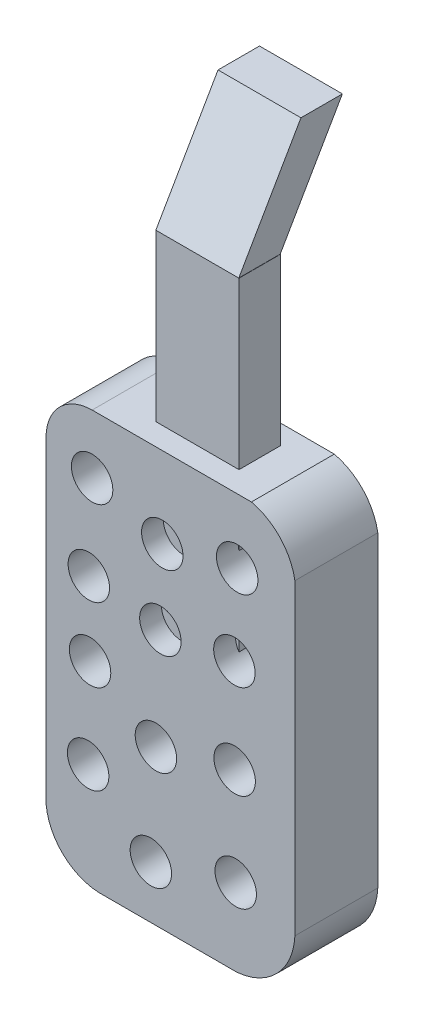
ISO-10303-21;
HEADER;
FILE_DESCRIPTION(('STEP AP214'),'2;1');
FILE_NAME('part.step','',(''),(''),'','','');
FILE_SCHEMA(('AUTOMOTIVE_DESIGN { 1 0 10303 214 1 1 1 1 }'));
ENDSEC;
DATA;
#1=APPLICATION_CONTEXT('core data for automotive mechanical design processes');
#2=APPLICATION_PROTOCOL_DEFINITION('international standard','automotive_design',2000,#1);
#3=PRODUCT_CONTEXT('',#1,'mechanical');
#4=PRODUCT('Part','Part','',(#3));
#5=PRODUCT_RELATED_PRODUCT_CATEGORY('part','',(#4));
#6=PRODUCT_DEFINITION_FORMATION('','',#4);
#7=PRODUCT_DEFINITION_CONTEXT('part definition',#1,'design');
#8=PRODUCT_DEFINITION('design','',#6,#7);
#9=PRODUCT_DEFINITION_SHAPE('','',#8);
#10=(LENGTH_UNIT() NAMED_UNIT(*) SI_UNIT(.MILLI.,.METRE.));
#11=(NAMED_UNIT(*) PLANE_ANGLE_UNIT() SI_UNIT($,.RADIAN.));
#12=(NAMED_UNIT(*) SI_UNIT($,.STERADIAN.) SOLID_ANGLE_UNIT());
#13=UNCERTAINTY_MEASURE_WITH_UNIT(LENGTH_MEASURE(1.E-05),#10,'distance_accuracy_value','');
#14=(GEOMETRIC_REPRESENTATION_CONTEXT(3) GLOBAL_UNCERTAINTY_ASSIGNED_CONTEXT((#13)) GLOBAL_UNIT_ASSIGNED_CONTEXT((#10,
#11,#12)) REPRESENTATION_CONTEXT('',''));
#15=CARTESIAN_POINT('',(0.,0.,0.));
#16=DIRECTION('',(0.,0.,1.));
#17=DIRECTION('',(1.,0.,0.));
#18=AXIS2_PLACEMENT_3D('',#15,#16,#17);
#19=CARTESIAN_POINT('',(-1.89108910891088,5.,2.));
#20=DIRECTION('',(0.,-1.,0.));
#21=DIRECTION('',(0.,0.,-1.));
#22=AXIS2_PLACEMENT_3D('',#19,#20,#21);
#23=PLANE('',#22);
#24=DIRECTION('',(1.,0.,0.));
#25=VECTOR('',#24,1.);
#26=CARTESIAN_POINT('',(-1.89108910891088,5.,1.47458865052035));
#27=LINE('',#26,#25);
#28=CARTESIAN_POINT('',(-0.880000000000001,5.,1.47458865052035));
#29=VERTEX_POINT('',#28);
#30=CARTESIAN_POINT('',(1.12575668165662,5.,1.47458865052035));
#31=VERTEX_POINT('',#30);
#32=EDGE_CURVE('E61',#29,#31,#27,.T.);
#33=ORIENTED_EDGE('',*,*,#32,.F.);
#34=DIRECTION('',(0.,0.,-1.));
#35=VECTOR('',#34,1.);
#36=CARTESIAN_POINT('',(-0.880000000000001,5.,1.47458865052035));
#37=LINE('',#36,#35);
#38=CARTESIAN_POINT('',(-0.880000000000001,5.,0.474588650520346));
#39=VERTEX_POINT('',#38);
#40=EDGE_CURVE('E172',#29,#39,#37,.T.);
#41=ORIENTED_EDGE('',*,*,#40,.T.);
#42=DIRECTION('',(-1.,0.,0.));
#43=VECTOR('',#42,1.);
#44=CARTESIAN_POINT('',(-1.89108910891088,5.,0.474588650520346));
#45=LINE('',#44,#43);
#46=CARTESIAN_POINT('',(1.12575668165662,5.,0.474588650520346));
#47=VERTEX_POINT('',#46);
#48=EDGE_CURVE('E46',#47,#39,#45,.T.);
#49=ORIENTED_EDGE('',*,*,#48,.F.);
#50=DIRECTION('',(0.,0.,-1.));
#51=VECTOR('',#50,1.);
#52=CARTESIAN_POINT('',(1.12575668165662,5.,2.));
#53=LINE('',#52,#51);
#54=EDGE_CURVE('E174',#31,#47,#53,.T.);
#55=ORIENTED_EDGE('',*,*,#54,.F.);
#56=EDGE_LOOP('',(#33,#41,#49,#55));
#57=FACE_BOUND('',#56,.T.);
#58=DIRECTION('',(-1.,0.,0.));
#59=VECTOR('',#58,1.);
#60=CARTESIAN_POINT('',(-1.89108910891088,5.,0.));
#61=LINE('',#60,#59);
#62=CARTESIAN_POINT('',(1.95049504950491,5.,0.));
#63=VERTEX_POINT('',#62);
#64=CARTESIAN_POINT('',(-1.89108910891088,5.,0.));
#65=VERTEX_POINT('',#64);
#66=EDGE_CURVE('E344',#63,#65,#61,.T.);
#67=ORIENTED_EDGE('',*,*,#66,.T.);
#68=DIRECTION('',(0.,0.,-1.));
#69=VECTOR('',#68,1.);
#70=CARTESIAN_POINT('',(-1.89108910891088,5.,2.));
#71=LINE('',#70,#69);
#72=CARTESIAN_POINT('',(-1.89108910891088,5.,2.));
#73=VERTEX_POINT('',#72);
#74=EDGE_CURVE('E354',#73,#65,#71,.T.);
#75=ORIENTED_EDGE('',*,*,#74,.F.);
#76=DIRECTION('',(-1.,0.,0.));
#77=VECTOR('',#76,1.);
#78=CARTESIAN_POINT('',(-1.89108910891088,5.,2.));
#79=LINE('',#78,#77);
#80=CARTESIAN_POINT('',(1.95049504950491,5.,2.));
#81=VERTEX_POINT('',#80);
#82=EDGE_CURVE('E327',#81,#73,#79,.T.);
#83=ORIENTED_EDGE('',*,*,#82,.F.);
#84=DIRECTION('',(0.,0.,-1.));
#85=VECTOR('',#84,1.);
#86=CARTESIAN_POINT('',(1.95049504950491,5.,2.));
#87=LINE('',#86,#85);
#88=EDGE_CURVE('E357',#81,#63,#87,.T.);
#89=ORIENTED_EDGE('',*,*,#88,.T.);
#90=EDGE_LOOP('',(#67,#75,#83,#89));
#91=FACE_BOUND('',#90,.T.);
#92=ADVANCED_FACE('F38',(#57,#91),#23,.F.);
#93=CARTESIAN_POINT('',(-0.199450068187109,3.04670724631257,1.00000000000955));
#94=DIRECTION('',(0.,0.,1.));
#95=DIRECTION('',(1.,0.,0.));
#96=AXIS2_PLACEMENT_3D('',#93,#94,#95);
#97=CYLINDRICAL_SURFACE('',#96,0.5);
#98=CARTESIAN_POINT('',(-0.199450068187109,3.04670724631257,2.00000000000955));
#99=DIRECTION('',(0.,0.,1.));
#100=DIRECTION('',(1.,0.,0.));
#101=AXIS2_PLACEMENT_3D('',#98,#99,#100);
#102=CIRCLE('',#101,0.5);
#103=CARTESIAN_POINT('',(0.300549931812891,3.04670724631257,2.00000000000955));
#104=VERTEX_POINT('',#103);
#105=EDGE_CURVE('E303',#104,#104,#102,.T.);
#106=ORIENTED_EDGE('',*,*,#105,.T.);
#107=EDGE_LOOP('',(#106));
#108=FACE_BOUND('',#107,.T.);
#109=CARTESIAN_POINT('',(-0.199450068187109,3.04670724631257,1.47458865052035));
#110=DIRECTION('',(0.,0.,-1.));
#111=DIRECTION('',(-1.,0.,0.));
#112=AXIS2_PLACEMENT_3D('',#109,#110,#111);
#113=CIRCLE('',#112,0.5);
#114=CARTESIAN_POINT('',(-0.699450068187109,3.04670724631257,1.47458865052035));
#115=VERTEX_POINT('',#114);
#116=EDGE_CURVE('E244',#115,#115,#113,.F.);
#117=ORIENTED_EDGE('',*,*,#116,.F.);
#118=EDGE_LOOP('',(#117));
#119=FACE_BOUND('',#118,.T.);
#120=ADVANCED_FACE('F404',(#108,#119),#97,.F.);
#121=CARTESIAN_POINT('',(1.60719420206298,3.44237727244169,1.));
#122=DIRECTION('',(0.,0.,1.));
#123=DIRECTION('',(1.,0.,0.));
#124=AXIS2_PLACEMENT_3D('',#121,#122,#123);
#125=CYLINDRICAL_SURFACE('',#124,0.5);
#126=CARTESIAN_POINT('',(1.60719420206298,3.44237727244169,2.));
#127=DIRECTION('',(0.,0.,1.));
#128=DIRECTION('',(1.,0.,0.));
#129=AXIS2_PLACEMENT_3D('',#126,#127,#128);
#130=CIRCLE('',#129,0.5);
#131=CARTESIAN_POINT('',(2.10719420206298,3.44237727244169,2.));
#132=VERTEX_POINT('',#131);
#133=EDGE_CURVE('E297',#132,#132,#130,.T.);
#134=ORIENTED_EDGE('',*,*,#133,.T.);
#135=EDGE_LOOP('',(#134));
#136=FACE_BOUND('',#135,.T.);
#137=DIRECTION('',(0.,0.,1.));
#138=VECTOR('',#137,1.);
#139=CARTESIAN_POINT('',(1.12575668165662,3.30740351964147,1.));
#140=LINE('',#139,#138);
#141=CARTESIAN_POINT('',(1.12575668165662,3.30740351964147,1.47458865052035));
#142=VERTEX_POINT('',#141);
#143=CARTESIAN_POINT('',(1.12575668165662,3.30740351964147,1.));
#144=VERTEX_POINT('',#143);
#145=EDGE_CURVE('E238',#142,#144,#140,.F.);
#146=ORIENTED_EDGE('',*,*,#145,.F.);
#147=CARTESIAN_POINT('',(1.60719420206298,3.44237727244169,1.47458865052035));
#148=DIRECTION('',(0.,0.,-1.));
#149=DIRECTION('',(-1.,0.,0.));
#150=AXIS2_PLACEMENT_3D('',#147,#148,#149);
#151=CIRCLE('',#150,0.5);
#152=CARTESIAN_POINT('',(1.12575668165662,3.57735102524191,1.47458865052035));
#153=VERTEX_POINT('',#152);
#154=EDGE_CURVE('E177',#153,#142,#151,.F.);
#155=ORIENTED_EDGE('',*,*,#154,.F.);
#156=DIRECTION('',(0.,0.,1.));
#157=VECTOR('',#156,1.);
#158=CARTESIAN_POINT('',(1.12575668165662,3.57735102524191,1.));
#159=LINE('',#158,#157);
#160=CARTESIAN_POINT('',(1.12575668165662,3.57735102524191,1.));
#161=VERTEX_POINT('',#160);
#162=EDGE_CURVE('E236',#161,#153,#159,.T.);
#163=ORIENTED_EDGE('',*,*,#162,.F.);
#164=CARTESIAN_POINT('',(1.60719420206298,3.44237727244169,1.));
#165=DIRECTION('',(0.,0.,1.));
#166=DIRECTION('',(1.,0.,0.));
#167=AXIS2_PLACEMENT_3D('',#164,#165,#166);
#168=CIRCLE('',#167,0.5);
#169=EDGE_CURVE('E300',#144,#161,#168,.T.);
#170=ORIENTED_EDGE('',*,*,#169,.F.);
#171=EDGE_LOOP('',(#146,#155,#163,#170));
#172=FACE_BOUND('',#171,.T.);
#173=ADVANCED_FACE('F409',(#136,#172),#125,.F.);
#174=CARTESIAN_POINT('',(1.60719420206298,3.44237727244169,1.));
#175=DIRECTION('',(0.,0.,1.));
#176=DIRECTION('',(1.,0.,0.));
#177=AXIS2_PLACEMENT_3D('',#174,#175,#176);
#178=PLANE('',#177);
#179=ORIENTED_EDGE('',*,*,#169,.T.);
#180=DIRECTION('',(0.,-1.,0.));
#181=VECTOR('',#180,1.);
#182=CARTESIAN_POINT('',(1.12575668165662,3.44237727244169,1.));
#183=LINE('',#182,#181);
#184=EDGE_CURVE('E233',#161,#144,#183,.T.);
#185=ORIENTED_EDGE('',*,*,#184,.T.);
#186=EDGE_LOOP('',(#179,#185));
#187=FACE_BOUND('',#186,.T.);
#188=ADVANCED_FACE('F487',(#187),#178,.T.);
#189=CARTESIAN_POINT('',(-0.245391974143416,1.23022672205764,1.00000000000955));
#190=DIRECTION('',(0.,0.,1.));
#191=DIRECTION('',(1.,0.,0.));
#192=AXIS2_PLACEMENT_3D('',#189,#190,#191);
#193=CYLINDRICAL_SURFACE('',#192,0.5);
#194=CARTESIAN_POINT('',(-0.245391974143416,1.23022672205764,2.00000000000955));
#195=DIRECTION('',(0.,0.,1.));
#196=DIRECTION('',(1.,0.,0.));
#197=AXIS2_PLACEMENT_3D('',#194,#195,#196);
#198=CIRCLE('',#197,0.5);
#199=CARTESIAN_POINT('',(0.254608025856584,1.23022672205764,2.00000000000955));
#200=VERTEX_POINT('',#199);
#201=EDGE_CURVE('E288',#200,#200,#198,.T.);
#202=ORIENTED_EDGE('',*,*,#201,.T.);
#203=EDGE_LOOP('',(#202));
#204=FACE_BOUND('',#203,.T.);
#205=CARTESIAN_POINT('',(-0.245391974143416,1.23022672205764,1.47458865052035));
#206=DIRECTION('',(0.,0.,-1.));
#207=DIRECTION('',(-1.,0.,0.));
#208=AXIS2_PLACEMENT_3D('',#205,#206,#207);
#209=CIRCLE('',#208,0.5);
#210=CARTESIAN_POINT('',(-0.745391974143416,1.23022672205764,1.47458865052035));
#211=VERTEX_POINT('',#210);
#212=EDGE_CURVE('E241',#211,#211,#209,.F.);
#213=ORIENTED_EDGE('',*,*,#212,.F.);
#214=EDGE_LOOP('',(#213));
#215=FACE_BOUND('',#214,.T.);
#216=ADVANCED_FACE('F491',(#204,#215),#193,.F.);
#217=CARTESIAN_POINT('',(1.54051220604856,1.46976243669883,1.00000000000955));
#218=DIRECTION('',(0.,0.,1.));
#219=DIRECTION('',(1.,0.,0.));
#220=AXIS2_PLACEMENT_3D('',#217,#218,#219);
#221=CYLINDRICAL_SURFACE('',#220,0.5);
#222=CARTESIAN_POINT('',(1.54051220604856,1.46976243669883,2.00000000000955));
#223=DIRECTION('',(0.,0.,1.));
#224=DIRECTION('',(1.,0.,0.));
#225=AXIS2_PLACEMENT_3D('',#222,#223,#224);
#226=CIRCLE('',#225,0.5);
#227=CARTESIAN_POINT('',(2.04051220604856,1.46976243669883,2.00000000000955));
#228=VERTEX_POINT('',#227);
#229=EDGE_CURVE('E282',#228,#228,#226,.T.);
#230=ORIENTED_EDGE('',*,*,#229,.T.);
#231=EDGE_LOOP('',(#230));
#232=FACE_BOUND('',#231,.T.);
#233=DIRECTION('',(0.,0.,1.));
#234=VECTOR('',#233,1.);
#235=CARTESIAN_POINT('',(1.12575668165662,1.19051728457194,1.00000000000955));
#236=LINE('',#235,#234);
#237=CARTESIAN_POINT('',(1.12575668165662,1.19051728457194,1.47458865052035));
#238=VERTEX_POINT('',#237);
#239=CARTESIAN_POINT('',(1.12575668165662,1.19051728457194,1.00000000000955));
#240=VERTEX_POINT('',#239);
#241=EDGE_CURVE('E231',#238,#240,#236,.F.);
#242=ORIENTED_EDGE('',*,*,#241,.F.);
#243=CARTESIAN_POINT('',(1.54051220604856,1.46976243669883,1.47458865052035));
#244=DIRECTION('',(0.,0.,-1.));
#245=DIRECTION('',(-1.,0.,0.));
#246=AXIS2_PLACEMENT_3D('',#243,#244,#245);
#247=CIRCLE('',#246,0.5);
#248=CARTESIAN_POINT('',(1.12575668165662,1.74900758882572,1.47458865052035));
#249=VERTEX_POINT('',#248);
#250=EDGE_CURVE('E245',#249,#238,#247,.F.);
#251=ORIENTED_EDGE('',*,*,#250,.F.);
#252=DIRECTION('',(0.,0.,1.));
#253=VECTOR('',#252,1.);
#254=CARTESIAN_POINT('',(1.12575668165662,1.74900758882572,1.00000000000955));
#255=LINE('',#254,#253);
#256=CARTESIAN_POINT('',(1.12575668165662,1.74900758882572,1.00000000000955));
#257=VERTEX_POINT('',#256);
#258=EDGE_CURVE('E228',#257,#249,#255,.T.);
#259=ORIENTED_EDGE('',*,*,#258,.F.);
#260=CARTESIAN_POINT('',(1.54051220604856,1.46976243669883,1.00000000000955));
#261=DIRECTION('',(0.,0.,1.));
#262=DIRECTION('',(1.,0.,0.));
#263=AXIS2_PLACEMENT_3D('',#260,#261,#262);
#264=CIRCLE('',#263,0.5);
#265=EDGE_CURVE('E285',#240,#257,#264,.T.);
#266=ORIENTED_EDGE('',*,*,#265,.F.);
#267=EDGE_LOOP('',(#242,#251,#259,#266));
#268=FACE_BOUND('',#267,.T.);
#269=ADVANCED_FACE('F503',(#232,#268),#221,.F.);
#270=CARTESIAN_POINT('',(1.54051220604856,1.46976243669883,1.00000000000955));
#271=DIRECTION('',(0.,0.,1.));
#272=DIRECTION('',(1.,0.,0.));
#273=AXIS2_PLACEMENT_3D('',#270,#271,#272);
#274=PLANE('',#273);
#275=ORIENTED_EDGE('',*,*,#265,.T.);
#276=DIRECTION('',(0.,-1.,0.));
#277=VECTOR('',#276,1.);
#278=CARTESIAN_POINT('',(1.12575668165662,1.46976243669883,1.00000000000955));
#279=LINE('',#278,#277);
#280=EDGE_CURVE('E372',#257,#240,#279,.T.);
#281=ORIENTED_EDGE('',*,*,#280,.T.);
#282=EDGE_LOOP('',(#275,#281));
#283=FACE_BOUND('',#282,.T.);
#284=ADVANCED_FACE('F433',(#283),#274,.T.);
#285=CARTESIAN_POINT('',(-1.67129992270383,-3.66574465270561,2.));
#286=DIRECTION('',(0.,0.,-1.));
#287=DIRECTION('',(-1.,0.,0.));
#288=AXIS2_PLACEMENT_3D('',#285,#286,#287);
#289=CYLINDRICAL_SURFACE('',#288,1.33566613313877);
#290=CARTESIAN_POINT('',(-1.67129992270383,-3.66574465270561,0.));
#291=DIRECTION('',(0.,0.,1.));
#292=DIRECTION('',(1.,0.,0.));
#293=AXIS2_PLACEMENT_3D('',#290,#291,#292);
#294=CIRCLE('',#293,1.33566613313877);
#295=CARTESIAN_POINT('',(-3.,-3.80198019801974,0.));
#296=VERTEX_POINT('',#295);
#297=CARTESIAN_POINT('',(-1.73267326732673,-5.,0.));
#298=VERTEX_POINT('',#297);
#299=EDGE_CURVE('E312',#296,#298,#294,.T.);
#300=ORIENTED_EDGE('',*,*,#299,.T.);
#301=DIRECTION('',(0.,0.,-1.));
#302=VECTOR('',#301,1.);
#303=CARTESIAN_POINT('',(-1.73267326732673,-5.,2.));
#304=LINE('',#303,#302);
#305=CARTESIAN_POINT('',(-1.73267326732673,-5.,2.));
#306=VERTEX_POINT('',#305);
#307=EDGE_CURVE('E369',#306,#298,#304,.T.);
#308=ORIENTED_EDGE('',*,*,#307,.F.);
#309=CARTESIAN_POINT('',(-1.67129992270383,-3.66574465270561,2.));
#310=DIRECTION('',(0.,0.,1.));
#311=DIRECTION('',(1.,0.,0.));
#312=AXIS2_PLACEMENT_3D('',#309,#310,#311);
#313=CIRCLE('',#312,1.33566613313877);
#314=CARTESIAN_POINT('',(-3.,-3.80198019801974,2.));
#315=VERTEX_POINT('',#314);
#316=EDGE_CURVE('E315',#315,#306,#313,.T.);
#317=ORIENTED_EDGE('',*,*,#316,.F.);
#318=DIRECTION('',(0.,0.,-1.));
#319=VECTOR('',#318,1.);
#320=CARTESIAN_POINT('',(-3.,-3.80198019801974,2.));
#321=LINE('',#320,#319);
#322=EDGE_CURVE('E333',#315,#296,#321,.T.);
#323=ORIENTED_EDGE('',*,*,#322,.T.);
#324=EDGE_LOOP('',(#300,#308,#317,#323));
#325=FACE_BOUND('',#324,.T.);
#326=ADVANCED_FACE('F40',(#325),#289,.T.);
#327=CARTESIAN_POINT('',(-1.73267326732673,-5.,2.));
#328=DIRECTION('',(0.,1.,0.));
#329=DIRECTION('',(0.,0.,1.));
#330=AXIS2_PLACEMENT_3D('',#327,#328,#329);
#331=PLANE('',#330);
#332=DIRECTION('',(1.,0.,0.));
#333=VECTOR('',#332,1.);
#334=CARTESIAN_POINT('',(-1.73267326732673,-5.,0.));
#335=LINE('',#334,#333);
#336=CARTESIAN_POINT('',(1.6089108910891,-5.,0.));
#337=VERTEX_POINT('',#336);
#338=EDGE_CURVE('E336',#298,#337,#335,.T.);
#339=ORIENTED_EDGE('',*,*,#338,.T.);
#340=DIRECTION('',(0.,0.,-1.));
#341=VECTOR('',#340,1.);
#342=CARTESIAN_POINT('',(1.6089108910891,-5.,2.));
#343=LINE('',#342,#341);
#344=CARTESIAN_POINT('',(1.6089108910891,-5.,2.));
#345=VERTEX_POINT('',#344);
#346=EDGE_CURVE('E366',#345,#337,#343,.T.);
#347=ORIENTED_EDGE('',*,*,#346,.F.);
#348=DIRECTION('',(1.,0.,0.));
#349=VECTOR('',#348,1.);
#350=CARTESIAN_POINT('',(-1.73267326732673,-5.,2.));
#351=LINE('',#350,#349);
#352=EDGE_CURVE('E318',#306,#345,#351,.T.);
#353=ORIENTED_EDGE('',*,*,#352,.F.);
#354=ORIENTED_EDGE('',*,*,#307,.T.);
#355=EDGE_LOOP('',(#339,#347,#353,#354));
#356=FACE_BOUND('',#355,.T.);
#357=ADVANCED_FACE('F426',(#356),#331,.F.);
#358=CARTESIAN_POINT('',(1.4651151002762,-3.47029473606105,2.));
#359=DIRECTION('',(0.,0.,-1.));
#360=DIRECTION('',(-1.,0.,0.));
#361=AXIS2_PLACEMENT_3D('',#358,#359,#360);
#362=CYLINDRICAL_SURFACE('',#361,1.53644896562758);
#363=CARTESIAN_POINT('',(1.4651151002762,-3.47029473606105,0.));
#364=DIRECTION('',(0.,0.,1.));
#365=DIRECTION('',(-1.,0.,0.));
#366=AXIS2_PLACEMENT_3D('',#363,#364,#365);
#367=CIRCLE('',#366,1.53644896562758);
#368=CARTESIAN_POINT('',(3.,-3.53960396039604,0.));
#369=VERTEX_POINT('',#368);
#370=EDGE_CURVE('E338',#337,#369,#367,.T.);
#371=ORIENTED_EDGE('',*,*,#370,.T.);
#372=DIRECTION('',(0.,0.,-1.));
#373=VECTOR('',#372,1.);
#374=CARTESIAN_POINT('',(3.,-3.53960396039604,2.));
#375=LINE('',#374,#373);
#376=CARTESIAN_POINT('',(3.,-3.53960396039604,2.));
#377=VERTEX_POINT('',#376);
#378=EDGE_CURVE('E363',#377,#369,#375,.T.);
#379=ORIENTED_EDGE('',*,*,#378,.F.);
#380=CARTESIAN_POINT('',(1.4651151002762,-3.47029473606105,2.));
#381=DIRECTION('',(0.,0.,1.));
#382=DIRECTION('',(-1.,0.,0.));
#383=AXIS2_PLACEMENT_3D('',#380,#381,#382);
#384=CIRCLE('',#383,1.53644896562758);
#385=EDGE_CURVE('E321',#345,#377,#384,.T.);
#386=ORIENTED_EDGE('',*,*,#385,.F.);
#387=ORIENTED_EDGE('',*,*,#346,.T.);
#388=EDGE_LOOP('',(#371,#379,#386,#387));
#389=FACE_BOUND('',#388,.T.);
#390=ADVANCED_FACE('F423',(#389),#362,.T.);
#391=CARTESIAN_POINT('',(3.,3.88118811881188,2.));
#392=DIRECTION('',(-1.,0.,0.));
#393=DIRECTION('',(0.,-1.,0.));
#394=AXIS2_PLACEMENT_3D('',#391,#392,#393);
#395=PLANE('',#394);
#396=DIRECTION('',(0.,1.,0.));
#397=VECTOR('',#396,1.);
#398=CARTESIAN_POINT('',(3.,3.88118811881188,0.));
#399=LINE('',#398,#397);
#400=CARTESIAN_POINT('',(3.,3.88118811881188,0.));
#401=VERTEX_POINT('',#400);
#402=EDGE_CURVE('E340',#369,#401,#399,.T.);
#403=ORIENTED_EDGE('',*,*,#402,.T.);
#404=DIRECTION('',(0.,0.,-1.));
#405=VECTOR('',#404,1.);
#406=CARTESIAN_POINT('',(3.,3.88118811881188,2.));
#407=LINE('',#406,#405);
#408=CARTESIAN_POINT('',(3.,3.88118811881188,2.));
#409=VERTEX_POINT('',#408);
#410=EDGE_CURVE('E360',#409,#401,#407,.T.);
#411=ORIENTED_EDGE('',*,*,#410,.F.);
#412=DIRECTION('',(0.,1.,0.));
#413=VECTOR('',#412,1.);
#414=CARTESIAN_POINT('',(3.,3.88118811881188,2.));
#415=LINE('',#414,#413);
#416=EDGE_CURVE('E323',#377,#409,#415,.T.);
#417=ORIENTED_EDGE('',*,*,#416,.F.);
#418=ORIENTED_EDGE('',*,*,#378,.T.);
#419=EDGE_LOOP('',(#403,#411,#417,#418));
#420=FACE_BOUND('',#419,.T.);
#421=ADVANCED_FACE('F419',(#420),#395,.F.);
#422=CARTESIAN_POINT('',(1.6335461950254,3.65103352001593,2.));
#423=DIRECTION('',(0.,0.,-1.));
#424=DIRECTION('',(-1.,0.,0.));
#425=AXIS2_PLACEMENT_3D('',#422,#423,#424);
#426=CYLINDRICAL_SURFACE('',#425,1.38570095636703);
#427=CARTESIAN_POINT('',(1.6335461950254,3.65103352001593,0.));
#428=DIRECTION('',(0.,0.,1.));
#429=DIRECTION('',(-1.,0.,0.));
#430=AXIS2_PLACEMENT_3D('',#427,#428,#429);
#431=CIRCLE('',#430,1.38570095636703);
#432=EDGE_CURVE('E342',#401,#63,#431,.T.);
#433=ORIENTED_EDGE('',*,*,#432,.T.);
#434=ORIENTED_EDGE('',*,*,#88,.F.);
#435=CARTESIAN_POINT('',(1.6335461950254,3.65103352001593,2.));
#436=DIRECTION('',(0.,0.,1.));
#437=DIRECTION('',(-1.,0.,0.));
#438=AXIS2_PLACEMENT_3D('',#435,#436,#437);
#439=CIRCLE('',#438,1.38570095636703);
#440=EDGE_CURVE('E325',#409,#81,#439,.T.);
#441=ORIENTED_EDGE('',*,*,#440,.F.);
#442=ORIENTED_EDGE('',*,*,#410,.T.);
#443=EDGE_LOOP('',(#433,#434,#441,#442));
#444=FACE_BOUND('',#443,.T.);
#445=ADVANCED_FACE('F416',(#444),#426,.T.);
#446=CARTESIAN_POINT('',(-1.88138681820285,3.87842976779921,2.));
#447=DIRECTION('',(0.,0.,-1.));
#448=DIRECTION('',(-1.,0.,0.));
#449=AXIS2_PLACEMENT_3D('',#446,#447,#448);
#450=CYLINDRICAL_SURFACE('',#449,1.12161219688621);
#451=CARTESIAN_POINT('',(-1.88138681820285,3.87842976779921,0.));
#452=DIRECTION('',(0.,0.,1.));
#453=DIRECTION('',(-1.,0.,0.));
#454=AXIS2_PLACEMENT_3D('',#451,#452,#453);
#455=CIRCLE('',#454,1.12161219688621);
#456=CARTESIAN_POINT('',(-3.,3.96039603960396,0.));
#457=VERTEX_POINT('',#456);
#458=EDGE_CURVE('E346',#65,#457,#455,.T.);
#459=ORIENTED_EDGE('',*,*,#458,.T.);
#460=DIRECTION('',(0.,0.,-1.));
#461=VECTOR('',#460,1.);
#462=CARTESIAN_POINT('',(-3.,3.96039603960396,2.));
#463=LINE('',#462,#461);
#464=CARTESIAN_POINT('',(-3.,3.96039603960396,2.));
#465=VERTEX_POINT('',#464);
#466=EDGE_CURVE('E351',#465,#457,#463,.T.);
#467=ORIENTED_EDGE('',*,*,#466,.F.);
#468=CARTESIAN_POINT('',(-1.88138681820285,3.87842976779921,2.));
#469=DIRECTION('',(0.,0.,1.));
#470=DIRECTION('',(-1.,0.,0.));
#471=AXIS2_PLACEMENT_3D('',#468,#469,#470);
#472=CIRCLE('',#471,1.12161219688621);
#473=EDGE_CURVE('E329',#73,#465,#472,.T.);
#474=ORIENTED_EDGE('',*,*,#473,.F.);
#475=ORIENTED_EDGE('',*,*,#74,.T.);
#476=EDGE_LOOP('',(#459,#467,#474,#475));
#477=FACE_BOUND('',#476,.T.);
#478=ADVANCED_FACE('F414',(#477),#450,.T.);
#479=CARTESIAN_POINT('',(-3.,3.96039603960396,2.));
#480=DIRECTION('',(1.,0.,0.));
#481=DIRECTION('',(0.,1.,0.));
#482=AXIS2_PLACEMENT_3D('',#479,#480,#481);
#483=PLANE('',#482);
#484=DIRECTION('',(0.,-1.,0.));
#485=VECTOR('',#484,1.);
#486=CARTESIAN_POINT('',(-3.,3.96039603960396,0.));
#487=LINE('',#486,#485);
#488=EDGE_CURVE('E319',#457,#296,#487,.T.);
#489=ORIENTED_EDGE('',*,*,#488,.T.);
#490=ORIENTED_EDGE('',*,*,#322,.F.);
#491=DIRECTION('',(0.,-1.,0.));
#492=VECTOR('',#491,1.);
#493=CARTESIAN_POINT('',(-3.,3.96039603960396,2.));
#494=LINE('',#493,#492);
#495=EDGE_CURVE('E331',#465,#315,#494,.T.);
#496=ORIENTED_EDGE('',*,*,#495,.F.);
#497=ORIENTED_EDGE('',*,*,#466,.T.);
#498=EDGE_LOOP('',(#489,#490,#496,#497));
#499=FACE_BOUND('',#498,.T.);
#500=ADVANCED_FACE('F460',(#499),#483,.F.);
#501=CARTESIAN_POINT('',(-1.67129992270383,-3.66574465270561,2.));
#502=DIRECTION('',(0.,0.,1.));
#503=DIRECTION('',(1.,0.,0.));
#504=AXIS2_PLACEMENT_3D('',#501,#502,#503);
#505=PLANE('',#504);
#506=CARTESIAN_POINT('',(1.57195459495441,-3.14116829424194,2.));
#507=DIRECTION('',(0.,0.,1.));
#508=DIRECTION('',(1.,0.,0.));
#509=AXIS2_PLACEMENT_3D('',#506,#507,#508);
#510=CIRCLE('',#509,0.5);
#511=CARTESIAN_POINT('',(2.07195459495441,-3.14116829424194,2.));
#512=VERTEX_POINT('',#511);
#513=EDGE_CURVE('E176',#512,#512,#510,.T.);
#514=ORIENTED_EDGE('',*,*,#513,.F.);
#515=EDGE_LOOP('',(#514));
#516=FACE_BOUND('',#515,.T.);
#517=CARTESIAN_POINT('',(-0.474910445374396,-3.73209539281558,2.));
#518=DIRECTION('',(0.,0.,1.));
#519=DIRECTION('',(1.,0.,0.));
#520=AXIS2_PLACEMENT_3D('',#517,#518,#519);
#521=CIRCLE('',#520,0.5);
#522=CARTESIAN_POINT('',(0.0250895546256044,-3.73209539281558,2.));
#523=VERTEX_POINT('',#522);
#524=EDGE_CURVE('E252',#523,#523,#521,.T.);
#525=ORIENTED_EDGE('',*,*,#524,.F.);
#526=EDGE_LOOP('',(#525));
#527=FACE_BOUND('',#526,.T.);
#528=CARTESIAN_POINT('',(-1.98809097297925,-2.45276920652771,2.));
#529=DIRECTION('',(0.,0.,1.));
#530=DIRECTION('',(1.,0.,0.));
#531=AXIS2_PLACEMENT_3D('',#528,#529,#530);
#532=CIRCLE('',#531,0.5);
#533=CARTESIAN_POINT('',(-1.48809097297925,-2.45276920652771,2.));
#534=VERTEX_POINT('',#533);
#535=EDGE_CURVE('E258',#534,#534,#532,.T.);
#536=ORIENTED_EDGE('',*,*,#535,.F.);
#537=EDGE_LOOP('',(#536));
#538=FACE_BOUND('',#537,.T.);
#539=CARTESIAN_POINT('',(-0.352575995417936,-1.26935830616048,2.));
#540=DIRECTION('',(0.,0.,1.));
#541=DIRECTION('',(1.,0.,0.));
#542=AXIS2_PLACEMENT_3D('',#539,#540,#541);
#543=CIRCLE('',#542,0.5);
#544=CARTESIAN_POINT('',(0.147424004582064,-1.26935830616048,2.));
#545=VERTEX_POINT('',#544);
#546=EDGE_CURVE('E264',#545,#545,#543,.T.);
#547=ORIENTED_EDGE('',*,*,#546,.F.);
#548=EDGE_LOOP('',(#547));
#549=FACE_BOUND('',#548,.T.);
#550=CARTESIAN_POINT('',(1.54638727128997,-0.795623556079761,2.00000000000955));
#551=DIRECTION('',(0.,0.,1.));
#552=DIRECTION('',(1.,0.,0.));
#553=AXIS2_PLACEMENT_3D('',#550,#551,#552);
#554=CIRCLE('',#553,0.5);
#555=CARTESIAN_POINT('',(2.04638727128997,-0.795623556079761,2.00000000000955));
#556=VERTEX_POINT('',#555);
#557=EDGE_CURVE('E270',#556,#556,#554,.T.);
#558=ORIENTED_EDGE('',*,*,#557,.F.);
#559=EDGE_LOOP('',(#558));
#560=FACE_BOUND('',#559,.T.);
#561=CARTESIAN_POINT('',(-1.94152143822635,-0.27225514137541,2.00000000000955));
#562=DIRECTION('',(0.,0.,1.));
#563=DIRECTION('',(1.,0.,0.));
#564=AXIS2_PLACEMENT_3D('',#561,#562,#563);
#565=CIRCLE('',#564,0.5);
#566=CARTESIAN_POINT('',(-1.44152143822635,-0.27225514137541,2.00000000000955));
#567=VERTEX_POINT('',#566);
#568=EDGE_CURVE('E276',#567,#567,#565,.T.);
#569=ORIENTED_EDGE('',*,*,#568,.F.);
#570=EDGE_LOOP('',(#569));
#571=FACE_BOUND('',#570,.T.);
#572=ORIENTED_EDGE('',*,*,#229,.F.);
#573=EDGE_LOOP('',(#572));
#574=FACE_BOUND('',#573,.T.);
#575=ORIENTED_EDGE('',*,*,#201,.F.);
#576=EDGE_LOOP('',(#575));
#577=FACE_BOUND('',#576,.T.);
#578=CARTESIAN_POINT('',(-1.971582048089,1.49168329963345,2.00000000000955));
#579=DIRECTION('',(0.,0.,1.));
#580=DIRECTION('',(1.,0.,0.));
#581=AXIS2_PLACEMENT_3D('',#578,#579,#580);
#582=CIRCLE('',#581,0.5);
#583=CARTESIAN_POINT('',(-1.471582048089,1.49168329963345,2.00000000000955));
#584=VERTEX_POINT('',#583);
#585=EDGE_CURVE('E293',#584,#584,#582,.T.);
#586=ORIENTED_EDGE('',*,*,#585,.F.);
#587=EDGE_LOOP('',(#586));
#588=FACE_BOUND('',#587,.T.);
#589=ORIENTED_EDGE('',*,*,#133,.F.);
#590=EDGE_LOOP('',(#589));
#591=FACE_BOUND('',#590,.T.);
#592=ORIENTED_EDGE('',*,*,#105,.F.);
#593=EDGE_LOOP('',(#592));
#594=FACE_BOUND('',#593,.T.);
#595=CARTESIAN_POINT('',(-1.89209762083361,3.57827274800995,2.));
#596=DIRECTION('',(0.,0.,1.));
#597=DIRECTION('',(1.,0.,0.));
#598=AXIS2_PLACEMENT_3D('',#595,#596,#597);
#599=CIRCLE('',#598,0.5);
#600=CARTESIAN_POINT('',(-1.39209762083361,3.57827274800995,2.));
#601=VERTEX_POINT('',#600);
#602=EDGE_CURVE('E308',#601,#601,#599,.T.);
#603=ORIENTED_EDGE('',*,*,#602,.F.);
#604=EDGE_LOOP('',(#603));
#605=FACE_BOUND('',#604,.T.);
#606=ORIENTED_EDGE('',*,*,#316,.T.);
#607=ORIENTED_EDGE('',*,*,#352,.T.);
#608=ORIENTED_EDGE('',*,*,#385,.T.);
#609=ORIENTED_EDGE('',*,*,#416,.T.);
#610=ORIENTED_EDGE('',*,*,#440,.T.);
#611=ORIENTED_EDGE('',*,*,#82,.T.);
#612=ORIENTED_EDGE('',*,*,#473,.T.);
#613=ORIENTED_EDGE('',*,*,#495,.T.);
#614=EDGE_LOOP('',(#606,#607,#608,#609,#610,#611,#612,#613));
#615=FACE_BOUND('',#614,.T.);
#616=ADVANCED_FACE('F452',(#516,#527,#538,#549,#560,#571,#574,#577,#588,#591,#594,#605,#615),
#505,.T.);
#617=CARTESIAN_POINT('',(-1.67129992270383,-3.66574465270561,0.));
#618=DIRECTION('',(0.,0.,1.));
#619=DIRECTION('',(1.,0.,0.));
#620=AXIS2_PLACEMENT_3D('',#617,#618,#619);
#621=PLANE('',#620);
#622=ORIENTED_EDGE('',*,*,#299,.F.);
#623=ORIENTED_EDGE('',*,*,#488,.F.);
#624=ORIENTED_EDGE('',*,*,#458,.F.);
#625=ORIENTED_EDGE('',*,*,#66,.F.);
#626=ORIENTED_EDGE('',*,*,#432,.F.);
#627=ORIENTED_EDGE('',*,*,#402,.F.);
#628=ORIENTED_EDGE('',*,*,#370,.F.);
#629=ORIENTED_EDGE('',*,*,#338,.F.);
#630=EDGE_LOOP('',(#622,#623,#624,#625,#626,#627,#628,#629));
#631=FACE_BOUND('',#630,.T.);
#632=ADVANCED_FACE('F443',(#631),#621,.F.);
#633=CARTESIAN_POINT('',(-1.89209762083361,3.57827274800995,1.));
#634=DIRECTION('',(0.,0.,1.));
#635=DIRECTION('',(1.,0.,0.));
#636=AXIS2_PLACEMENT_3D('',#633,#634,#635);
#637=CYLINDRICAL_SURFACE('',#636,0.5);
#638=CARTESIAN_POINT('',(-1.89209762083361,3.57827274800995,1.));
#639=DIRECTION('',(0.,0.,1.));
#640=DIRECTION('',(1.,0.,0.));
#641=AXIS2_PLACEMENT_3D('',#638,#639,#640);
#642=CIRCLE('',#641,0.5);
#643=CARTESIAN_POINT('',(-1.39209762083361,3.57827274800995,1.));
#644=VERTEX_POINT('',#643);
#645=EDGE_CURVE('E309',#644,#644,#642,.T.);
#646=ORIENTED_EDGE('',*,*,#645,.F.);
#647=EDGE_LOOP('',(#646));
#648=FACE_BOUND('',#647,.T.);
#649=ORIENTED_EDGE('',*,*,#602,.T.);
#650=EDGE_LOOP('',(#649));
#651=FACE_BOUND('',#650,.T.);
#652=ADVANCED_FACE('F475',(#648,#651),#637,.F.);
#653=CARTESIAN_POINT('',(-1.89209762083361,3.57827274800995,1.));
#654=DIRECTION('',(0.,0.,1.));
#655=DIRECTION('',(1.,0.,0.));
#656=AXIS2_PLACEMENT_3D('',#653,#654,#655);
#657=PLANE('',#656);
#658=ORIENTED_EDGE('',*,*,#645,.T.);
#659=EDGE_LOOP('',(#658));
#660=FACE_BOUND('',#659,.T.);
#661=ADVANCED_FACE('F479',(#660),#657,.T.);
#662=CARTESIAN_POINT('',(-1.971582048089,1.49168329963345,1.00000000000955));
#663=DIRECTION('',(0.,0.,1.));
#664=DIRECTION('',(1.,0.,0.));
#665=AXIS2_PLACEMENT_3D('',#662,#663,#664);
#666=CYLINDRICAL_SURFACE('',#665,0.5);
#667=CARTESIAN_POINT('',(-1.971582048089,1.49168329963345,1.00000000000955));
#668=DIRECTION('',(0.,0.,1.));
#669=DIRECTION('',(1.,0.,0.));
#670=AXIS2_PLACEMENT_3D('',#667,#668,#669);
#671=CIRCLE('',#670,0.5);
#672=CARTESIAN_POINT('',(-1.471582048089,1.49168329963345,1.00000000000955));
#673=VERTEX_POINT('',#672);
#674=EDGE_CURVE('E294',#673,#673,#671,.T.);
#675=ORIENTED_EDGE('',*,*,#674,.F.);
#676=EDGE_LOOP('',(#675));
#677=FACE_BOUND('',#676,.T.);
#678=ORIENTED_EDGE('',*,*,#585,.T.);
#679=EDGE_LOOP('',(#678));
#680=FACE_BOUND('',#679,.T.);
#681=ADVANCED_FACE('F482',(#677,#680),#666,.F.);
#682=CARTESIAN_POINT('',(-1.971582048089,1.49168329963345,1.00000000000955));
#683=DIRECTION('',(0.,0.,1.));
#684=DIRECTION('',(1.,0.,0.));
#685=AXIS2_PLACEMENT_3D('',#682,#683,#684);
#686=PLANE('',#685);
#687=ORIENTED_EDGE('',*,*,#674,.T.);
#688=EDGE_LOOP('',(#687));
#689=FACE_BOUND('',#688,.T.);
#690=ADVANCED_FACE('F495',(#689),#686,.T.);
#691=CARTESIAN_POINT('',(-1.94152143822635,-0.27225514137541,1.00000000000955));
#692=DIRECTION('',(0.,0.,1.));
#693=DIRECTION('',(1.,0.,0.));
#694=AXIS2_PLACEMENT_3D('',#691,#692,#693);
#695=CYLINDRICAL_SURFACE('',#694,0.5);
#696=CARTESIAN_POINT('',(-1.94152143822635,-0.27225514137541,1.00000000000955));
#697=DIRECTION('',(0.,0.,1.));
#698=DIRECTION('',(1.,0.,0.));
#699=AXIS2_PLACEMENT_3D('',#696,#697,#698);
#700=CIRCLE('',#699,0.5);
#701=CARTESIAN_POINT('',(-1.44152143822635,-0.27225514137541,1.00000000000955));
#702=VERTEX_POINT('',#701);
#703=EDGE_CURVE('E279',#702,#702,#700,.T.);
#704=ORIENTED_EDGE('',*,*,#703,.F.);
#705=EDGE_LOOP('',(#704));
#706=FACE_BOUND('',#705,.T.);
#707=ORIENTED_EDGE('',*,*,#568,.T.);
#708=EDGE_LOOP('',(#707));
#709=FACE_BOUND('',#708,.T.);
#710=ADVANCED_FACE('F499',(#706,#709),#695,.F.);
#711=CARTESIAN_POINT('',(-1.94152143822635,-0.27225514137541,1.00000000000955));
#712=DIRECTION('',(0.,0.,1.));
#713=DIRECTION('',(1.,0.,0.));
#714=AXIS2_PLACEMENT_3D('',#711,#712,#713);
#715=PLANE('',#714);
#716=ORIENTED_EDGE('',*,*,#703,.T.);
#717=EDGE_LOOP('',(#716));
#718=FACE_BOUND('',#717,.T.);
#719=ADVANCED_FACE('F513',(#718),#715,.T.);
#720=CARTESIAN_POINT('',(1.54638727128997,-0.795623556079761,1.00000000000954));
#721=DIRECTION('',(0.,0.,1.));
#722=DIRECTION('',(1.,0.,0.));
#723=AXIS2_PLACEMENT_3D('',#720,#721,#722);
#724=CYLINDRICAL_SURFACE('',#723,0.5);
#725=CARTESIAN_POINT('',(1.54638727128997,-0.795623556079761,1.00000000000954));
#726=DIRECTION('',(0.,0.,1.));
#727=DIRECTION('',(1.,0.,0.));
#728=AXIS2_PLACEMENT_3D('',#725,#726,#727);
#729=CIRCLE('',#728,0.5);
#730=CARTESIAN_POINT('',(2.04638727128997,-0.795623556079761,1.00000000000954));
#731=VERTEX_POINT('',#730);
#732=EDGE_CURVE('E273',#731,#731,#729,.T.);
#733=ORIENTED_EDGE('',*,*,#732,.F.);
#734=EDGE_LOOP('',(#733));
#735=FACE_BOUND('',#734,.T.);
#736=ORIENTED_EDGE('',*,*,#557,.T.);
#737=EDGE_LOOP('',(#736));
#738=FACE_BOUND('',#737,.T.);
#739=ADVANCED_FACE('F517',(#735,#738),#724,.F.);
#740=CARTESIAN_POINT('',(1.54638727128997,-0.795623556079761,1.00000000000954));
#741=DIRECTION('',(0.,0.,1.));
#742=DIRECTION('',(1.,0.,0.));
#743=AXIS2_PLACEMENT_3D('',#740,#741,#742);
#744=PLANE('',#743);
#745=ORIENTED_EDGE('',*,*,#732,.T.);
#746=EDGE_LOOP('',(#745));
#747=FACE_BOUND('',#746,.T.);
#748=ADVANCED_FACE('F521',(#747),#744,.T.);
#749=CARTESIAN_POINT('',(-0.352575995417936,-1.26935830616048,0.999999999999984));
#750=DIRECTION('',(0.,0.,1.));
#751=DIRECTION('',(1.,0.,0.));
#752=AXIS2_PLACEMENT_3D('',#749,#750,#751);
#753=CYLINDRICAL_SURFACE('',#752,0.5);
#754=CARTESIAN_POINT('',(-0.352575995417936,-1.26935830616048,0.999999999999984));
#755=DIRECTION('',(0.,0.,1.));
#756=DIRECTION('',(1.,0.,0.));
#757=AXIS2_PLACEMENT_3D('',#754,#755,#756);
#758=CIRCLE('',#757,0.5);
#759=CARTESIAN_POINT('',(0.147424004582064,-1.26935830616048,0.999999999999984));
#760=VERTEX_POINT('',#759);
#761=EDGE_CURVE('E267',#760,#760,#758,.T.);
#762=ORIENTED_EDGE('',*,*,#761,.F.);
#763=EDGE_LOOP('',(#762));
#764=FACE_BOUND('',#763,.T.);
#765=ORIENTED_EDGE('',*,*,#546,.T.);
#766=EDGE_LOOP('',(#765));
#767=FACE_BOUND('',#766,.T.);
#768=ADVANCED_FACE('F525',(#764,#767),#753,.F.);
#769=CARTESIAN_POINT('',(-0.352575995417936,-1.26935830616048,0.999999999999984));
#770=DIRECTION('',(0.,0.,1.));
#771=DIRECTION('',(1.,0.,0.));
#772=AXIS2_PLACEMENT_3D('',#769,#770,#771);
#773=PLANE('',#772);
#774=ORIENTED_EDGE('',*,*,#761,.T.);
#775=EDGE_LOOP('',(#774));
#776=FACE_BOUND('',#775,.T.);
#777=ADVANCED_FACE('F529',(#776),#773,.T.);
#778=CARTESIAN_POINT('',(-1.98809097297925,-2.45276920652771,1.));
#779=DIRECTION('',(0.,0.,1.));
#780=DIRECTION('',(1.,0.,0.));
#781=AXIS2_PLACEMENT_3D('',#778,#779,#780);
#782=CYLINDRICAL_SURFACE('',#781,0.5);
#783=CARTESIAN_POINT('',(-1.98809097297925,-2.45276920652771,1.));
#784=DIRECTION('',(0.,0.,1.));
#785=DIRECTION('',(1.,0.,0.));
#786=AXIS2_PLACEMENT_3D('',#783,#784,#785);
#787=CIRCLE('',#786,0.5);
#788=CARTESIAN_POINT('',(-1.48809097297925,-2.45276920652771,1.));
#789=VERTEX_POINT('',#788);
#790=EDGE_CURVE('E261',#789,#789,#787,.T.);
#791=ORIENTED_EDGE('',*,*,#790,.F.);
#792=EDGE_LOOP('',(#791));
#793=FACE_BOUND('',#792,.T.);
#794=ORIENTED_EDGE('',*,*,#535,.T.);
#795=EDGE_LOOP('',(#794));
#796=FACE_BOUND('',#795,.T.);
#797=ADVANCED_FACE('F533',(#793,#796),#782,.F.);
#798=CARTESIAN_POINT('',(-1.98809097297925,-2.45276920652771,1.));
#799=DIRECTION('',(0.,0.,1.));
#800=DIRECTION('',(1.,0.,0.));
#801=AXIS2_PLACEMENT_3D('',#798,#799,#800);
#802=PLANE('',#801);
#803=ORIENTED_EDGE('',*,*,#790,.T.);
#804=EDGE_LOOP('',(#803));
#805=FACE_BOUND('',#804,.T.);
#806=ADVANCED_FACE('F537',(#805),#802,.T.);
#807=CARTESIAN_POINT('',(-0.474910445374396,-3.73209539281558,0.999999999999984));
#808=DIRECTION('',(0.,0.,1.));
#809=DIRECTION('',(1.,0.,0.));
#810=AXIS2_PLACEMENT_3D('',#807,#808,#809);
#811=CYLINDRICAL_SURFACE('',#810,0.5);
#812=CARTESIAN_POINT('',(-0.474910445374396,-3.73209539281558,0.999999999999984));
#813=DIRECTION('',(0.,0.,1.));
#814=DIRECTION('',(1.,0.,0.));
#815=AXIS2_PLACEMENT_3D('',#812,#813,#814);
#816=CIRCLE('',#815,0.5);
#817=CARTESIAN_POINT('',(0.0250895546256044,-3.73209539281558,0.999999999999984));
#818=VERTEX_POINT('',#817);
#819=EDGE_CURVE('E255',#818,#818,#816,.T.);
#820=ORIENTED_EDGE('',*,*,#819,.F.);
#821=EDGE_LOOP('',(#820));
#822=FACE_BOUND('',#821,.T.);
#823=ORIENTED_EDGE('',*,*,#524,.T.);
#824=EDGE_LOOP('',(#823));
#825=FACE_BOUND('',#824,.T.);
#826=ADVANCED_FACE('F541',(#822,#825),#811,.F.);
#827=CARTESIAN_POINT('',(-0.474910445374396,-3.73209539281558,0.999999999999984));
#828=DIRECTION('',(0.,0.,1.));
#829=DIRECTION('',(1.,0.,0.));
#830=AXIS2_PLACEMENT_3D('',#827,#828,#829);
#831=PLANE('',#830);
#832=ORIENTED_EDGE('',*,*,#819,.T.);
#833=EDGE_LOOP('',(#832));
#834=FACE_BOUND('',#833,.T.);
#835=ADVANCED_FACE('F545',(#834),#831,.T.);
#836=CARTESIAN_POINT('',(1.57195459495441,-3.14116829424194,0.999999999999984));
#837=DIRECTION('',(0.,0.,1.));
#838=DIRECTION('',(1.,0.,0.));
#839=AXIS2_PLACEMENT_3D('',#836,#837,#838);
#840=CYLINDRICAL_SURFACE('',#839,0.5);
#841=CARTESIAN_POINT('',(1.57195459495441,-3.14116829424194,0.999999999999984));
#842=DIRECTION('',(0.,0.,1.));
#843=DIRECTION('',(1.,0.,0.));
#844=AXIS2_PLACEMENT_3D('',#841,#842,#843);
#845=CIRCLE('',#844,0.5);
#846=CARTESIAN_POINT('',(2.07195459495441,-3.14116829424194,0.999999999999984));
#847=VERTEX_POINT('',#846);
#848=EDGE_CURVE('E249',#847,#847,#845,.T.);
#849=ORIENTED_EDGE('',*,*,#848,.F.);
#850=EDGE_LOOP('',(#849));
#851=FACE_BOUND('',#850,.T.);
#852=ORIENTED_EDGE('',*,*,#513,.T.);
#853=EDGE_LOOP('',(#852));
#854=FACE_BOUND('',#853,.T.);
#855=ADVANCED_FACE('F549',(#851,#854),#840,.F.);
#856=CARTESIAN_POINT('',(1.57195459495441,-3.14116829424194,0.999999999999984));
#857=DIRECTION('',(0.,0.,1.));
#858=DIRECTION('',(1.,0.,0.));
#859=AXIS2_PLACEMENT_3D('',#856,#857,#858);
#860=PLANE('',#859);
#861=ORIENTED_EDGE('',*,*,#848,.T.);
#862=EDGE_LOOP('',(#861));
#863=FACE_BOUND('',#862,.T.);
#864=ADVANCED_FACE('F553',(#863),#860,.T.);
#865=CARTESIAN_POINT('',(1.12575668165662,9.,1.47458865052035));
#866=DIRECTION('',(-1.,0.,0.));
#867=DIRECTION('',(0.,0.,1.));
#868=AXIS2_PLACEMENT_3D('',#865,#866,#867);
#869=PLANE('',#868);
#870=DIRECTION('',(0.,-1.,0.));
#871=VECTOR('',#870,1.);
#872=CARTESIAN_POINT('',(1.12575668165662,9.,1.47458865052035));
#873=LINE('',#872,#871);
#874=EDGE_CURVE('E225',#249,#238,#873,.T.);
#875=ORIENTED_EDGE('',*,*,#874,.T.);
#876=ORIENTED_EDGE('',*,*,#241,.T.);
#877=ORIENTED_EDGE('',*,*,#280,.F.);
#878=ORIENTED_EDGE('',*,*,#258,.T.);
#879=EDGE_LOOP('',(#875,#876,#877,#878));
#880=FACE_BOUND('',#879,.T.);
#881=ADVANCED_FACE('F557',(#880),#869,.F.);
#882=CARTESIAN_POINT('',(-0.874243318343377,9.,1.47458865052035));
#883=DIRECTION('',(0.,0.,-1.));
#884=DIRECTION('',(-1.,0.,0.));
#885=AXIS2_PLACEMENT_3D('',#882,#883,#884);
#886=PLANE('',#885);
#887=ORIENTED_EDGE('',*,*,#874,.F.);
#888=ORIENTED_EDGE('',*,*,#250,.T.);
#889=EDGE_LOOP('',(#887,#888));
#890=FACE_BOUND('',#889,.T.);
#891=ADVANCED_FACE('F562',(#890),#886,.F.);
#892=ORIENTED_EDGE('',*,*,#212,.T.);
#893=EDGE_LOOP('',(#892));
#894=FACE_BOUND('',#893,.T.);
#895=ADVANCED_FACE('F651',(#894),#886,.F.);
#896=EDGE_CURVE('E229',#153,#142,#873,.T.);
#897=ORIENTED_EDGE('',*,*,#896,.T.);
#898=ORIENTED_EDGE('',*,*,#145,.T.);
#899=ORIENTED_EDGE('',*,*,#184,.F.);
#900=ORIENTED_EDGE('',*,*,#162,.T.);
#901=EDGE_LOOP('',(#897,#898,#899,#900));
#902=FACE_BOUND('',#901,.T.);
#903=ADVANCED_FACE('F565',(#902),#869,.F.);
#904=ORIENTED_EDGE('',*,*,#896,.F.);
#905=ORIENTED_EDGE('',*,*,#154,.T.);
#906=EDGE_LOOP('',(#904,#905));
#907=FACE_BOUND('',#906,.T.);
#908=ADVANCED_FACE('F641',(#907),#886,.F.);
#909=ORIENTED_EDGE('',*,*,#116,.T.);
#910=EDGE_LOOP('',(#909));
#911=FACE_BOUND('',#910,.T.);
#912=ADVANCED_FACE('F561',(#911),#886,.F.);
#913=CARTESIAN_POINT('',(-0.874243318343377,9.,0.474588650520346));
#914=DIRECTION('',(0.,0.,1.));
#915=DIRECTION('',(1.,0.,0.));
#916=AXIS2_PLACEMENT_3D('',#913,#914,#915);
#917=PLANE('',#916);
#918=ORIENTED_EDGE('',*,*,#48,.T.);
#919=DIRECTION('',(0.,1.,0.));
#920=VECTOR('',#919,1.);
#921=CARTESIAN_POINT('',(-0.880000000000001,5.,0.474588650520346));
#922=LINE('',#921,#920);
#923=CARTESIAN_POINT('',(-0.880000000000001,9.,0.474588650520346));
#924=VERTEX_POINT('',#923);
#925=EDGE_CURVE('E188',#39,#924,#922,.T.);
#926=ORIENTED_EDGE('',*,*,#925,.T.);
#927=DIRECTION('',(-1.,0.,0.));
#928=VECTOR('',#927,1.);
#929=CARTESIAN_POINT('',(-0.874243318343377,9.,0.474588650520346));
#930=LINE('',#929,#928);
#931=CARTESIAN_POINT('',(1.12,9.,0.474588650520346));
#932=VERTEX_POINT('',#931);
#933=EDGE_CURVE('E218',#932,#924,#930,.T.);
#934=ORIENTED_EDGE('',*,*,#933,.F.);
#935=CARTESIAN_POINT('',(1.12575668165662,9.,0.474588650520346));
#936=VERTEX_POINT('',#935);
#937=EDGE_CURVE('E219',#936,#932,#930,.T.);
#938=ORIENTED_EDGE('',*,*,#937,.F.);
#939=DIRECTION('',(0.,-1.,0.));
#940=VECTOR('',#939,1.);
#941=CARTESIAN_POINT('',(1.12575668165662,9.,0.474588650520346));
#942=LINE('',#941,#940);
#943=EDGE_CURVE('E222',#936,#47,#942,.T.);
#944=ORIENTED_EDGE('',*,*,#943,.T.);
#945=EDGE_LOOP('',(#918,#926,#934,#938,#944));
#946=FACE_BOUND('',#945,.T.);
#947=ADVANCED_FACE('F376',(#946),#917,.F.);
#948=DIRECTION('',(1.,0.,0.));
#949=VECTOR('',#948,1.);
#950=CARTESIAN_POINT('',(-0.874243318343377,9.,1.47458865052035));
#951=LINE('',#950,#949);
#952=CARTESIAN_POINT('',(1.12,9.,1.47458865052035));
#953=VERTEX_POINT('',#952);
#954=CARTESIAN_POINT('',(1.12575668165662,9.,1.47458865052035));
#955=VERTEX_POINT('',#954);
#956=EDGE_CURVE('E213',#953,#955,#951,.T.);
#957=ORIENTED_EDGE('',*,*,#956,.F.);
#958=CARTESIAN_POINT('',(-0.880000000000001,9.,1.47458865052035));
#959=VERTEX_POINT('',#958);
#960=EDGE_CURVE('E192',#959,#953,#951,.T.);
#961=ORIENTED_EDGE('',*,*,#960,.F.);
#962=DIRECTION('',(0.,-1.,0.));
#963=VECTOR('',#962,1.);
#964=CARTESIAN_POINT('',(-0.880000000000001,9.,1.47458865052035));
#965=LINE('',#964,#963);
#966=EDGE_CURVE('E184',#959,#29,#965,.T.);
#967=ORIENTED_EDGE('',*,*,#966,.T.);
#968=ORIENTED_EDGE('',*,*,#32,.T.);
#969=EDGE_CURVE('E226',#955,#31,#873,.T.);
#970=ORIENTED_EDGE('',*,*,#969,.F.);
#971=EDGE_LOOP('',(#957,#961,#967,#968,#970));
#972=FACE_BOUND('',#971,.T.);
#973=ADVANCED_FACE('F191',(#972),#886,.F.);
#974=ORIENTED_EDGE('',*,*,#969,.T.);
#975=ORIENTED_EDGE('',*,*,#54,.T.);
#976=ORIENTED_EDGE('',*,*,#943,.F.);
#977=DIRECTION('',(0.,0.,-1.));
#978=VECTOR('',#977,1.);
#979=CARTESIAN_POINT('',(1.12575668165662,9.,1.47458865052035));
#980=LINE('',#979,#978);
#981=EDGE_CURVE('E216',#955,#936,#980,.T.);
#982=ORIENTED_EDGE('',*,*,#981,.F.);
#983=EDGE_LOOP('',(#974,#975,#976,#982));
#984=FACE_BOUND('',#983,.T.);
#985=ADVANCED_FACE('F381',(#984),#869,.F.);
#986=CARTESIAN_POINT('',(0.,9.,0.));
#987=DIRECTION('',(0.,-1.,0.));
#988=DIRECTION('',(0.,0.,-1.));
#989=AXIS2_PLACEMENT_3D('',#986,#987,#988);
#990=PLANE('',#989);
#991=ORIENTED_EDGE('',*,*,#937,.T.);
#992=DIRECTION('',(0.,0.,1.));
#993=VECTOR('',#992,1.);
#994=CARTESIAN_POINT('',(1.12,9.,0.));
#995=LINE('',#994,#993);
#996=EDGE_CURVE('E11',#932,#953,#995,.T.);
#997=ORIENTED_EDGE('',*,*,#996,.T.);
#998=ORIENTED_EDGE('',*,*,#956,.T.);
#999=ORIENTED_EDGE('',*,*,#981,.T.);
#1000=EDGE_LOOP('',(#991,#997,#998,#999));
#1001=FACE_BOUND('',#1000,.T.);
#1002=ADVANCED_FACE('F384',(#1001),#990,.F.);
#1003=CARTESIAN_POINT('',(1.12,0.,0.));
#1004=DIRECTION('',(1.,0.,0.));
#1005=DIRECTION('',(0.,0.,-1.));
#1006=AXIS2_PLACEMENT_3D('',#1003,#1004,#1005);
#1007=PLANE('',#1006);
#1008=ORIENTED_EDGE('',*,*,#996,.F.);
#1009=DIRECTION('',(0.,0.86602540378444,-0.499999999999998));
#1010=VECTOR('',#1009,1.);
#1011=CARTESIAN_POINT('',(1.12,9.,0.474588650520346));
#1012=LINE('',#1011,#1010);
#1013=CARTESIAN_POINT('',(1.12,11.5980762113533,-1.02541134947964));
#1014=VERTEX_POINT('',#1013);
#1015=EDGE_CURVE('E207',#932,#1014,#1012,.T.);
#1016=ORIENTED_EDGE('',*,*,#1015,.T.);
#1017=DIRECTION('',(0.,0.,1.));
#1018=VECTOR('',#1017,1.);
#1019=CARTESIAN_POINT('',(1.12,11.5980762113533,-1.02541134947964));
#1020=LINE('',#1019,#1018);
#1021=CARTESIAN_POINT('',(1.12,11.5980762113533,-0.0254113494796651));
#1022=VERTEX_POINT('',#1021);
#1023=EDGE_CURVE('E194',#1014,#1022,#1020,.T.);
#1024=ORIENTED_EDGE('',*,*,#1023,.T.);
#1025=DIRECTION('',(0.,-0.866025403784437,0.500000000000004));
#1026=VECTOR('',#1025,1.);
#1027=CARTESIAN_POINT('',(1.12,9.,1.47458865052035));
#1028=LINE('',#1027,#1026);
#1029=EDGE_CURVE('E53',#1022,#953,#1028,.T.);
#1030=ORIENTED_EDGE('',*,*,#1029,.T.);
#1031=EDGE_LOOP('',(#1008,#1016,#1024,#1030));
#1032=FACE_BOUND('',#1031,.T.);
#1033=ADVANCED_FACE('F386',(#1032),#1007,.T.);
#1034=CARTESIAN_POINT('',(-0.880000000000001,9.,1.47458865052035));
#1035=DIRECTION('',(0.,0.500000000000004,0.866025403784437));
#1036=DIRECTION('',(0.,-0.866025403784437,0.500000000000004));
#1037=AXIS2_PLACEMENT_3D('',#1034,#1035,#1036);
#1038=PLANE('',#1037);
#1039=ORIENTED_EDGE('',*,*,#1029,.F.);
#1040=DIRECTION('',(1.,0.,0.));
#1041=VECTOR('',#1040,1.);
#1042=CARTESIAN_POINT('',(-0.880000000000001,11.5980762113533,-0.0254113494796651));
#1043=LINE('',#1042,#1041);
#1044=CARTESIAN_POINT('',(-0.880000000000001,11.5980762113533,-0.0254113494796651));
#1045=VERTEX_POINT('',#1044);
#1046=EDGE_CURVE('E211',#1045,#1022,#1043,.T.);
#1047=ORIENTED_EDGE('',*,*,#1046,.F.);
#1048=DIRECTION('',(0.,-0.866025403784437,0.500000000000004));
#1049=VECTOR('',#1048,1.);
#1050=CARTESIAN_POINT('',(-0.880000000000001,9.,1.47458865052035));
#1051=LINE('',#1050,#1049);
#1052=EDGE_CURVE('E204',#1045,#959,#1051,.T.);
#1053=ORIENTED_EDGE('',*,*,#1052,.T.);
#1054=ORIENTED_EDGE('',*,*,#960,.T.);
#1055=EDGE_LOOP('',(#1039,#1047,#1053,#1054));
#1056=FACE_BOUND('',#1055,.T.);
#1057=ADVANCED_FACE('F394',(#1056),#1038,.T.);
#1058=CARTESIAN_POINT('',(-0.880000000000001,11.5980762113533,-1.02541134947964));
#1059=DIRECTION('',(0.,1.,0.));
#1060=DIRECTION('',(0.,0.,1.));
#1061=AXIS2_PLACEMENT_3D('',#1058,#1059,#1060);
#1062=PLANE('',#1061);
#1063=ORIENTED_EDGE('',*,*,#1023,.F.);
#1064=DIRECTION('',(1.,0.,0.));
#1065=VECTOR('',#1064,1.);
#1066=CARTESIAN_POINT('',(-0.880000000000001,11.5980762113533,-1.02541134947964));
#1067=LINE('',#1066,#1065);
#1068=CARTESIAN_POINT('',(-0.880000000000001,11.5980762113533,-1.02541134947964));
#1069=VERTEX_POINT('',#1068);
#1070=EDGE_CURVE('E206',#1069,#1014,#1067,.T.);
#1071=ORIENTED_EDGE('',*,*,#1070,.F.);
#1072=DIRECTION('',(0.,0.,1.));
#1073=VECTOR('',#1072,1.);
#1074=CARTESIAN_POINT('',(-0.880000000000001,11.5980762113533,-1.02541134947964));
#1075=LINE('',#1074,#1073);
#1076=EDGE_CURVE('E201',#1069,#1045,#1075,.T.);
#1077=ORIENTED_EDGE('',*,*,#1076,.T.);
#1078=ORIENTED_EDGE('',*,*,#1046,.T.);
#1079=EDGE_LOOP('',(#1063,#1071,#1077,#1078));
#1080=FACE_BOUND('',#1079,.T.);
#1081=ADVANCED_FACE('F392',(#1080),#1062,.T.);
#1082=CARTESIAN_POINT('',(-0.880000000000001,9.,0.474588650520346));
#1083=DIRECTION('',(0.,-0.499999999999998,-0.86602540378444));
#1084=DIRECTION('',(0.,0.86602540378444,-0.499999999999998));
#1085=AXIS2_PLACEMENT_3D('',#1082,#1083,#1084);
#1086=PLANE('',#1085);
#1087=ORIENTED_EDGE('',*,*,#1015,.F.);
#1088=ORIENTED_EDGE('',*,*,#933,.T.);
#1089=DIRECTION('',(0.,0.86602540378444,-0.499999999999998));
#1090=VECTOR('',#1089,1.);
#1091=CARTESIAN_POINT('',(-0.880000000000001,9.,0.474588650520346));
#1092=LINE('',#1091,#1090);
#1093=EDGE_CURVE('E198',#924,#1069,#1092,.T.);
#1094=ORIENTED_EDGE('',*,*,#1093,.T.);
#1095=ORIENTED_EDGE('',*,*,#1070,.T.);
#1096=EDGE_LOOP('',(#1087,#1088,#1094,#1095));
#1097=FACE_BOUND('',#1096,.T.);
#1098=ADVANCED_FACE('F388',(#1097),#1086,.T.);
#1099=CARTESIAN_POINT('',(-0.880000000000001,0.,0.));
#1100=DIRECTION('',(1.,0.,0.));
#1101=DIRECTION('',(0.,0.,-1.));
#1102=AXIS2_PLACEMENT_3D('',#1099,#1100,#1101);
#1103=PLANE('',#1102);
#1104=ORIENTED_EDGE('',*,*,#966,.F.);
#1105=ORIENTED_EDGE('',*,*,#1052,.F.);
#1106=ORIENTED_EDGE('',*,*,#1076,.F.);
#1107=ORIENTED_EDGE('',*,*,#1093,.F.);
#1108=ORIENTED_EDGE('',*,*,#925,.F.);
#1109=ORIENTED_EDGE('',*,*,#40,.F.);
#1110=EDGE_LOOP('',(#1104,#1105,#1106,#1107,#1108,#1109));
#1111=FACE_BOUND('',#1110,.T.);
#1112=ADVANCED_FACE('F182',(#1111),#1103,.F.);
#1113=CLOSED_SHELL('',(#92,#120,#173,#188,#216,#269,#284,#326,#357,#390,#421,#445,#478,#500,
#616,#632,#652,#661,#681,#690,#710,#719,#739,#748,#768,#777,#797,#806,#826,#835,#855,#864,#881,
#891,#895,#903,#908,#912,#947,#973,#985,#1002,#1033,#1057,#1081,#1098,#1112));
#1114=MANIFOLD_SOLID_BREP('B2',#1113);
#1115=ADVANCED_BREP_SHAPE_REPRESENTATION('',(#18,#1114),#14);
#1116=SHAPE_DEFINITION_REPRESENTATION(#9,#1115);
ENDSEC;
END-ISO-10303-21;
